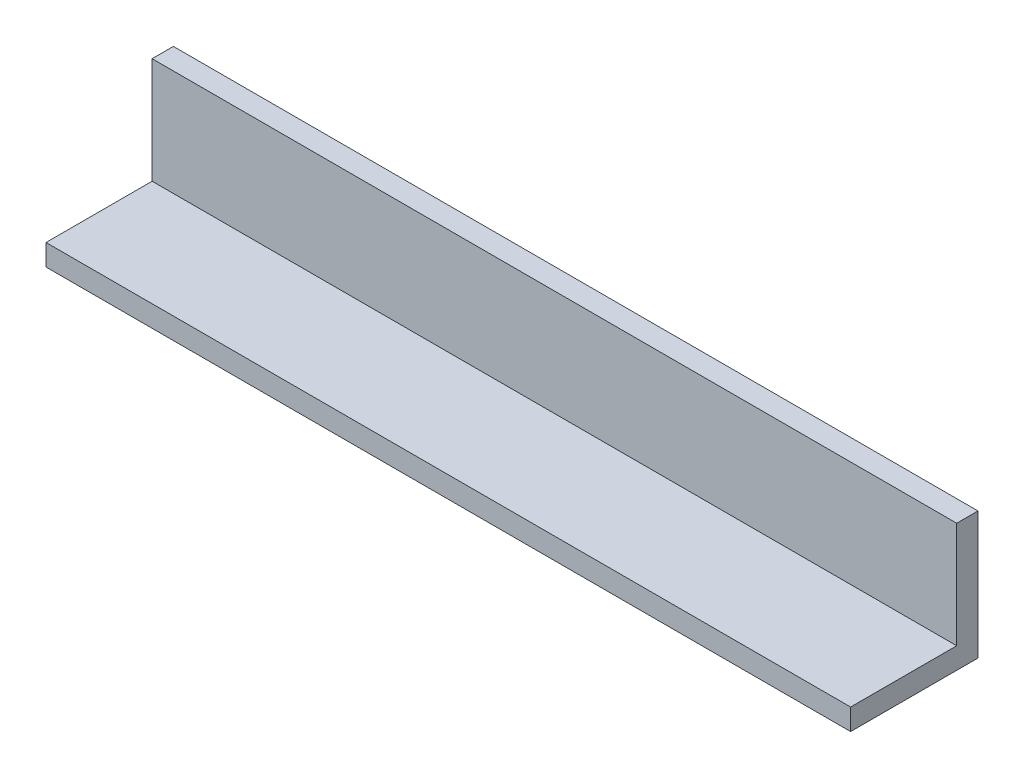
ISO-10303-21;
HEADER;
FILE_DESCRIPTION(('STEP AP214'),'2;1');
FILE_NAME('part.step','',(''),(''),'','','');
FILE_SCHEMA(('AUTOMOTIVE_DESIGN { 1 0 10303 214 1 1 1 1 }'));
ENDSEC;
DATA;
#1=APPLICATION_CONTEXT('core data for automotive mechanical design processes');
#2=APPLICATION_PROTOCOL_DEFINITION('international standard','automotive_design',2000,#1);
#3=PRODUCT_CONTEXT('',#1,'mechanical');
#4=PRODUCT('Part','Part','',(#3));
#5=PRODUCT_RELATED_PRODUCT_CATEGORY('part','',(#4));
#6=PRODUCT_DEFINITION_FORMATION('','',#4);
#7=PRODUCT_DEFINITION_CONTEXT('part definition',#1,'design');
#8=PRODUCT_DEFINITION('design','',#6,#7);
#9=PRODUCT_DEFINITION_SHAPE('','',#8);
#10=(LENGTH_UNIT() NAMED_UNIT(*) SI_UNIT(.MILLI.,.METRE.));
#11=(NAMED_UNIT(*) PLANE_ANGLE_UNIT() SI_UNIT($,.RADIAN.));
#12=(NAMED_UNIT(*) SI_UNIT($,.STERADIAN.) SOLID_ANGLE_UNIT());
#13=UNCERTAINTY_MEASURE_WITH_UNIT(LENGTH_MEASURE(1.E-05),#10,'distance_accuracy_value','');
#14=(GEOMETRIC_REPRESENTATION_CONTEXT(3) GLOBAL_UNCERTAINTY_ASSIGNED_CONTEXT((#13)) GLOBAL_UNIT_ASSIGNED_CONTEXT((#10,
#11,#12)) REPRESENTATION_CONTEXT('',''));
#15=CARTESIAN_POINT('',(0.,0.,0.));
#16=DIRECTION('',(0.,0.,1.));
#17=DIRECTION('',(1.,0.,0.));
#18=AXIS2_PLACEMENT_3D('',#15,#16,#17);
#19=CARTESIAN_POINT('',(120.,6.35,-19.));
#20=DIRECTION('',(-1.,0.,0.));
#21=DIRECTION('',(0.,0.,1.));
#22=AXIS2_PLACEMENT_3D('',#19,#20,#21);
#23=PLANE('',#22);
#24=DIRECTION('',(0.,0.,-1.));
#25=VECTOR('',#24,1.);
#26=CARTESIAN_POINT('',(120.,0.,-19.));
#27=LINE('',#26,#25);
#28=CARTESIAN_POINT('',(120.,0.,19.));
#29=VERTEX_POINT('',#28);
#30=CARTESIAN_POINT('',(120.,0.,-19.));
#31=VERTEX_POINT('',#30);
#32=EDGE_CURVE('E88',#29,#31,#27,.T.);
#33=ORIENTED_EDGE('',*,*,#32,.T.);
#34=DIRECTION('',(0.,-1.,0.));
#35=VECTOR('',#34,1.);
#36=CARTESIAN_POINT('',(120.,6.35,-19.));
#37=LINE('',#36,#35);
#38=CARTESIAN_POINT('',(120.,38.,-19.));
#39=VERTEX_POINT('',#38);
#40=EDGE_CURVE('E11',#39,#31,#37,.T.);
#41=ORIENTED_EDGE('',*,*,#40,.F.);
#42=DIRECTION('',(0.,0.,-1.));
#43=VECTOR('',#42,1.);
#44=CARTESIAN_POINT('',(120.,38.,-19.));
#45=LINE('',#44,#43);
#46=CARTESIAN_POINT('',(120.,38.,-12.65));
#47=VERTEX_POINT('',#46);
#48=EDGE_CURVE('E124',#47,#39,#45,.T.);
#49=ORIENTED_EDGE('',*,*,#48,.F.);
#50=DIRECTION('',(0.,-1.,0.));
#51=VECTOR('',#50,1.);
#52=CARTESIAN_POINT('',(120.,38.,-12.65));
#53=LINE('',#52,#51);
#54=CARTESIAN_POINT('',(120.,6.35,-12.65));
#55=VERTEX_POINT('',#54);
#56=EDGE_CURVE('E97',#47,#55,#53,.T.);
#57=ORIENTED_EDGE('',*,*,#56,.T.);
#58=DIRECTION('',(0.,0.,-1.));
#59=VECTOR('',#58,1.);
#60=CARTESIAN_POINT('',(120.,6.35,-19.));
#61=LINE('',#60,#59);
#62=CARTESIAN_POINT('',(120.,6.35,19.));
#63=VERTEX_POINT('',#62);
#64=EDGE_CURVE('E82',#63,#55,#61,.T.);
#65=ORIENTED_EDGE('',*,*,#64,.F.);
#66=DIRECTION('',(0.,-1.,0.));
#67=VECTOR('',#66,1.);
#68=CARTESIAN_POINT('',(120.,6.35,19.));
#69=LINE('',#68,#67);
#70=EDGE_CURVE('E75',#63,#29,#69,.T.);
#71=ORIENTED_EDGE('',*,*,#70,.T.);
#72=EDGE_LOOP('',(#33,#41,#49,#57,#65,#71));
#73=FACE_BOUND('',#72,.T.);
#74=ADVANCED_FACE('F33',(#73),#23,.F.);
#75=CARTESIAN_POINT('',(-120.,6.35,-19.));
#76=DIRECTION('',(0.,0.,1.));
#77=DIRECTION('',(1.,0.,0.));
#78=AXIS2_PLACEMENT_3D('',#75,#76,#77);
#79=PLANE('',#78);
#80=DIRECTION('',(-1.,0.,0.));
#81=VECTOR('',#80,1.);
#82=CARTESIAN_POINT('',(-120.,0.,-19.));
#83=LINE('',#82,#81);
#84=CARTESIAN_POINT('',(-120.,0.,-19.));
#85=VERTEX_POINT('',#84);
#86=EDGE_CURVE('E92',#31,#85,#83,.T.);
#87=ORIENTED_EDGE('',*,*,#86,.T.);
#88=DIRECTION('',(0.,-1.,0.));
#89=VECTOR('',#88,1.);
#90=CARTESIAN_POINT('',(-120.,6.35,-19.));
#91=LINE('',#90,#89);
#92=CARTESIAN_POINT('',(-120.,38.,-19.));
#93=VERTEX_POINT('',#92);
#94=EDGE_CURVE('E40',#93,#85,#91,.T.);
#95=ORIENTED_EDGE('',*,*,#94,.F.);
#96=DIRECTION('',(-1.,0.,0.));
#97=VECTOR('',#96,1.);
#98=CARTESIAN_POINT('',(-120.,38.,-19.));
#99=LINE('',#98,#97);
#100=EDGE_CURVE('E116',#39,#93,#99,.T.);
#101=ORIENTED_EDGE('',*,*,#100,.F.);
#102=ORIENTED_EDGE('',*,*,#40,.T.);
#103=EDGE_LOOP('',(#87,#95,#101,#102));
#104=FACE_BOUND('',#103,.T.);
#105=ADVANCED_FACE('F114',(#104),#79,.F.);
#106=CARTESIAN_POINT('',(-120.,6.35,-19.));
#107=DIRECTION('',(1.,0.,0.));
#108=DIRECTION('',(0.,0.,-1.));
#109=AXIS2_PLACEMENT_3D('',#106,#107,#108);
#110=PLANE('',#109);
#111=DIRECTION('',(0.,0.,1.));
#112=VECTOR('',#111,1.);
#113=CARTESIAN_POINT('',(-120.,0.,-19.));
#114=LINE('',#113,#112);
#115=CARTESIAN_POINT('',(-120.,0.,19.));
#116=VERTEX_POINT('',#115);
#117=EDGE_CURVE('E83',#85,#116,#114,.T.);
#118=ORIENTED_EDGE('',*,*,#117,.T.);
#119=DIRECTION('',(0.,-1.,0.));
#120=VECTOR('',#119,1.);
#121=CARTESIAN_POINT('',(-120.,6.35,19.));
#122=LINE('',#121,#120);
#123=CARTESIAN_POINT('',(-120.,6.35,19.));
#124=VERTEX_POINT('',#123);
#125=EDGE_CURVE('E78',#124,#116,#122,.T.);
#126=ORIENTED_EDGE('',*,*,#125,.F.);
#127=DIRECTION('',(0.,0.,1.));
#128=VECTOR('',#127,1.);
#129=CARTESIAN_POINT('',(-120.,6.35,-19.));
#130=LINE('',#129,#128);
#131=CARTESIAN_POINT('',(-120.,6.35,-12.65));
#132=VERTEX_POINT('',#131);
#133=EDGE_CURVE('E132',#132,#124,#130,.T.);
#134=ORIENTED_EDGE('',*,*,#133,.F.);
#135=DIRECTION('',(0.,-1.,0.));
#136=VECTOR('',#135,1.);
#137=CARTESIAN_POINT('',(-120.,38.,-12.65));
#138=LINE('',#137,#136);
#139=CARTESIAN_POINT('',(-120.,38.,-12.65));
#140=VERTEX_POINT('',#139);
#141=EDGE_CURVE('E93',#140,#132,#138,.T.);
#142=ORIENTED_EDGE('',*,*,#141,.F.);
#143=DIRECTION('',(0.,0.,1.));
#144=VECTOR('',#143,1.);
#145=CARTESIAN_POINT('',(-120.,38.,-19.));
#146=LINE('',#145,#144);
#147=EDGE_CURVE('E110',#93,#140,#146,.T.);
#148=ORIENTED_EDGE('',*,*,#147,.F.);
#149=ORIENTED_EDGE('',*,*,#94,.T.);
#150=EDGE_LOOP('',(#118,#126,#134,#142,#148,#149));
#151=FACE_BOUND('',#150,.T.);
#152=ADVANCED_FACE('F107',(#151),#110,.F.);
#153=CARTESIAN_POINT('',(-120.,6.35,19.));
#154=DIRECTION('',(0.,0.,-1.));
#155=DIRECTION('',(-1.,0.,0.));
#156=AXIS2_PLACEMENT_3D('',#153,#154,#155);
#157=PLANE('',#156);
#158=DIRECTION('',(1.,0.,0.));
#159=VECTOR('',#158,1.);
#160=CARTESIAN_POINT('',(-120.,0.,19.));
#161=LINE('',#160,#159);
#162=EDGE_CURVE('E72',#116,#29,#161,.T.);
#163=ORIENTED_EDGE('',*,*,#162,.T.);
#164=ORIENTED_EDGE('',*,*,#70,.F.);
#165=DIRECTION('',(1.,0.,0.));
#166=VECTOR('',#165,1.);
#167=CARTESIAN_POINT('',(-120.,6.35,19.));
#168=LINE('',#167,#166);
#169=EDGE_CURVE('E53',#124,#63,#168,.T.);
#170=ORIENTED_EDGE('',*,*,#169,.F.);
#171=ORIENTED_EDGE('',*,*,#125,.T.);
#172=EDGE_LOOP('',(#163,#164,#170,#171));
#173=FACE_BOUND('',#172,.T.);
#174=ADVANCED_FACE('F74',(#173),#157,.F.);
#175=CARTESIAN_POINT('',(0.,6.35,0.));
#176=DIRECTION('',(0.,1.,0.));
#177=DIRECTION('',(0.,0.,1.));
#178=AXIS2_PLACEMENT_3D('',#175,#176,#177);
#179=PLANE('',#178);
#180=DIRECTION('',(1.,0.,0.));
#181=VECTOR('',#180,1.);
#182=CARTESIAN_POINT('',(-120.,6.35,-12.65));
#183=LINE('',#182,#181);
#184=EDGE_CURVE('E47',#132,#55,#183,.T.);
#185=ORIENTED_EDGE('',*,*,#184,.F.);
#186=ORIENTED_EDGE('',*,*,#133,.T.);
#187=ORIENTED_EDGE('',*,*,#169,.T.);
#188=ORIENTED_EDGE('',*,*,#64,.T.);
#189=EDGE_LOOP('',(#185,#186,#187,#188));
#190=FACE_BOUND('',#189,.T.);
#191=ADVANCED_FACE('F133',(#190),#179,.T.);
#192=CARTESIAN_POINT('',(0.,0.,0.));
#193=DIRECTION('',(0.,1.,0.));
#194=DIRECTION('',(0.,0.,1.));
#195=AXIS2_PLACEMENT_3D('',#192,#193,#194);
#196=PLANE('',#195);
#197=ORIENTED_EDGE('',*,*,#32,.F.);
#198=ORIENTED_EDGE('',*,*,#162,.F.);
#199=ORIENTED_EDGE('',*,*,#117,.F.);
#200=ORIENTED_EDGE('',*,*,#86,.F.);
#201=EDGE_LOOP('',(#197,#198,#199,#200));
#202=FACE_BOUND('',#201,.T.);
#203=ADVANCED_FACE('F91',(#202),#196,.F.);
#204=CARTESIAN_POINT('',(-120.,38.,-12.65));
#205=DIRECTION('',(0.,0.,-1.));
#206=DIRECTION('',(-1.,0.,0.));
#207=AXIS2_PLACEMENT_3D('',#204,#205,#206);
#208=PLANE('',#207);
#209=ORIENTED_EDGE('',*,*,#184,.T.);
#210=ORIENTED_EDGE('',*,*,#56,.F.);
#211=DIRECTION('',(1.,0.,0.));
#212=VECTOR('',#211,1.);
#213=CARTESIAN_POINT('',(-120.,38.,-12.65));
#214=LINE('',#213,#212);
#215=EDGE_CURVE('E127',#140,#47,#214,.T.);
#216=ORIENTED_EDGE('',*,*,#215,.F.);
#217=ORIENTED_EDGE('',*,*,#141,.T.);
#218=EDGE_LOOP('',(#209,#210,#216,#217));
#219=FACE_BOUND('',#218,.T.);
#220=ADVANCED_FACE('F136',(#219),#208,.F.);
#221=CARTESIAN_POINT('',(0.,38.,0.));
#222=DIRECTION('',(0.,1.,0.));
#223=DIRECTION('',(0.,0.,1.));
#224=AXIS2_PLACEMENT_3D('',#221,#222,#223);
#225=PLANE('',#224);
#226=ORIENTED_EDGE('',*,*,#147,.T.);
#227=ORIENTED_EDGE('',*,*,#215,.T.);
#228=ORIENTED_EDGE('',*,*,#48,.T.);
#229=ORIENTED_EDGE('',*,*,#100,.T.);
#230=EDGE_LOOP('',(#226,#227,#228,#229));
#231=FACE_BOUND('',#230,.T.);
#232=ADVANCED_FACE('F120',(#231),#225,.T.);
#233=CLOSED_SHELL('',(#74,#105,#152,#174,#191,#203,#220,#232));
#234=MANIFOLD_SOLID_BREP('B2',#233);
#235=ADVANCED_BREP_SHAPE_REPRESENTATION('',(#18,#234),#14);
#236=SHAPE_DEFINITION_REPRESENTATION(#9,#235);
ENDSEC;
END-ISO-10303-21;
